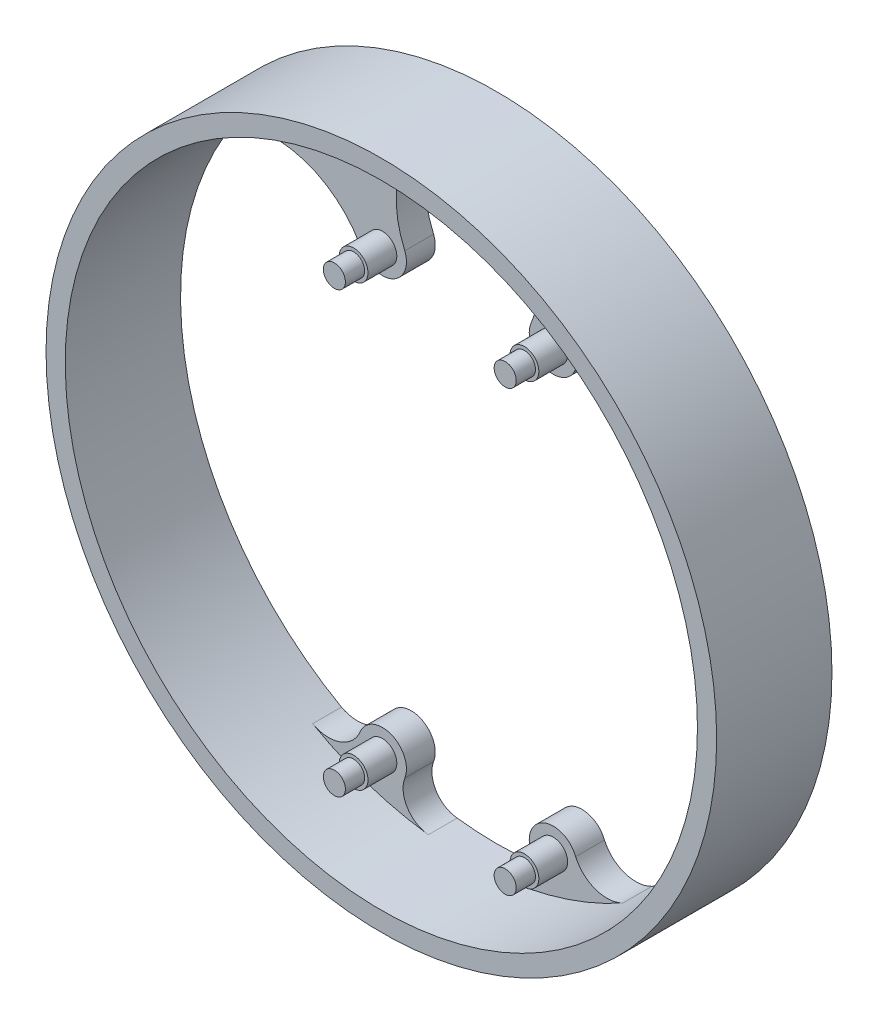
ISO-10303-21;
HEADER;
FILE_DESCRIPTION(('STEP AP214'),'2;1');
FILE_NAME('part.step','',(''),(''),'','','');
FILE_SCHEMA(('AUTOMOTIVE_DESIGN { 1 0 10303 214 1 1 1 1 }'));
ENDSEC;
DATA;
#1=APPLICATION_CONTEXT('core data for automotive mechanical design processes');
#2=APPLICATION_PROTOCOL_DEFINITION('international standard','automotive_design',2000,#1);
#3=PRODUCT_CONTEXT('',#1,'mechanical');
#4=PRODUCT('Part','Part','',(#3));
#5=PRODUCT_RELATED_PRODUCT_CATEGORY('part','',(#4));
#6=PRODUCT_DEFINITION_FORMATION('','',#4);
#7=PRODUCT_DEFINITION_CONTEXT('part definition',#1,'design');
#8=PRODUCT_DEFINITION('design','',#6,#7);
#9=PRODUCT_DEFINITION_SHAPE('','',#8);
#10=(LENGTH_UNIT() NAMED_UNIT(*) SI_UNIT(.MILLI.,.METRE.));
#11=(NAMED_UNIT(*) PLANE_ANGLE_UNIT() SI_UNIT($,.RADIAN.));
#12=(NAMED_UNIT(*) SI_UNIT($,.STERADIAN.) SOLID_ANGLE_UNIT());
#13=UNCERTAINTY_MEASURE_WITH_UNIT(LENGTH_MEASURE(1.E-05),#10,'distance_accuracy_value','');
#14=(GEOMETRIC_REPRESENTATION_CONTEXT(3) GLOBAL_UNCERTAINTY_ASSIGNED_CONTEXT((#13)) GLOBAL_UNIT_ASSIGNED_CONTEXT((#10,
#11,#12)) REPRESENTATION_CONTEXT('',''));
#15=CARTESIAN_POINT('',(0.,0.,0.));
#16=DIRECTION('',(0.,0.,1.));
#17=DIRECTION('',(1.,0.,0.));
#18=AXIS2_PLACEMENT_3D('',#15,#16,#17);
#19=CARTESIAN_POINT('',(0.,0.,3.));
#20=DIRECTION('',(0.,0.,1.));
#21=DIRECTION('',(1.,0.,0.));
#22=AXIS2_PLACEMENT_3D('',#19,#20,#21);
#23=PLANE('',#22);
#24=CARTESIAN_POINT('',(0.,0.,3.));
#25=DIRECTION('',(0.,0.,1.));
#26=DIRECTION('',(1.,0.,0.));
#27=AXIS2_PLACEMENT_3D('',#24,#25,#26);
#28=CIRCLE('',#27,32.9);
#29=CARTESIAN_POINT('',(4.32104825385738,-32.6150048595403,3.));
#30=VERTEX_POINT('',#29);
#31=CARTESIAN_POINT('',(16.1545217327961,-28.6607994931163,3.));
#32=VERTEX_POINT('',#31);
#33=EDGE_CURVE('E356',#30,#32,#28,.T.);
#34=ORIENTED_EDGE('',*,*,#33,.T.);
#35=CARTESIAN_POINT('',(14.4856400572003,-25.4993295163461,3.));
#36=DIRECTION('',(0.,0.,1.));
#37=DIRECTION('',(1.,0.,0.));
#38=AXIS2_PLACEMENT_3D('',#35,#36,#37);
#39=CIRCLE('',#38,3.57492076292037);
#40=CARTESIAN_POINT('',(11.2200116788582,-26.9538843471193,3.));
#41=VERTEX_POINT('',#40);
#42=EDGE_CURVE('E387',#41,#32,#39,.T.);
#43=ORIENTED_EDGE('',*,*,#42,.F.);
#44=CARTESIAN_POINT('',(8.89000000000505,-27.8600000000069,3.));
#45=DIRECTION('',(0.,0.,-1.));
#46=DIRECTION('',(1.,0.,0.));
#47=AXIS2_PLACEMENT_3D('',#44,#45,#46);
#48=CIRCLE('',#47,2.5);
#49=CARTESIAN_POINT('',(6.55998832115192,-28.7661156528945,3.));
#50=VERTEX_POINT('',#49);
#51=EDGE_CURVE('E385',#50,#41,#48,.T.);
#52=ORIENTED_EDGE('',*,*,#51,.F.);
#53=CARTESIAN_POINT('',(3.84469156337696,-29.762250761899,3.));
#54=DIRECTION('',(0.,0.,1.));
#55=DIRECTION('',(-1.,0.,0.));
#56=AXIS2_PLACEMENT_3D('',#53,#54,#55);
#57=CIRCLE('',#56,2.89225200115318);
#58=EDGE_CURVE('E313',#30,#50,#57,.T.);
#59=ORIENTED_EDGE('',*,*,#58,.F.);
#60=EDGE_LOOP('',(#34,#43,#52,#59));
#61=FACE_BOUND('',#60,.T.);
#62=CARTESIAN_POINT('',(8.89000000000505,-27.8600000000069,3.));
#63=DIRECTION('',(0.,0.,1.));
#64=DIRECTION('',(-1.,0.,0.));
#65=AXIS2_PLACEMENT_3D('',#62,#63,#64);
#66=CIRCLE('',#65,1.5);
#67=CARTESIAN_POINT('',(7.39000000000505,-27.8600000000069,3.));
#68=VERTEX_POINT('',#67);
#69=EDGE_CURVE('E360',#68,#68,#66,.T.);
#70=ORIENTED_EDGE('',*,*,#69,.F.);
#71=EDGE_LOOP('',(#70));
#72=FACE_BOUND('',#71,.T.);
#73=ADVANCED_FACE('F33',(#61,#72),#23,.T.);
#74=CARTESIAN_POINT('',(-16.1545217327962,-28.6607994931163,3.));
#75=VERTEX_POINT('',#74);
#76=CARTESIAN_POINT('',(-4.32104825385683,-32.6150048595403,3.));
#77=VERTEX_POINT('',#76);
#78=EDGE_CURVE('E160',#75,#77,#28,.T.);
#79=ORIENTED_EDGE('',*,*,#78,.T.);
#80=CARTESIAN_POINT('',(-3.84469156337696,-29.762250761899,3.));
#81=DIRECTION('',(0.,0.,1.));
#82=DIRECTION('',(1.,0.,0.));
#83=AXIS2_PLACEMENT_3D('',#80,#81,#82);
#84=CIRCLE('',#83,2.89225200115317);
#85=CARTESIAN_POINT('',(-6.5599883211519,-28.7661156528945,3.));
#86=VERTEX_POINT('',#85);
#87=EDGE_CURVE('E305',#86,#77,#84,.T.);
#88=ORIENTED_EDGE('',*,*,#87,.F.);
#89=CARTESIAN_POINT('',(-8.89000000000505,-27.8600000000069,3.));
#90=DIRECTION('',(0.,0.,-1.));
#91=DIRECTION('',(-1.,0.,0.));
#92=AXIS2_PLACEMENT_3D('',#89,#90,#91);
#93=CIRCLE('',#92,2.5);
#94=CARTESIAN_POINT('',(-11.2200116788582,-26.9538843471193,3.));
#95=VERTEX_POINT('',#94);
#96=EDGE_CURVE('E314',#95,#86,#93,.T.);
#97=ORIENTED_EDGE('',*,*,#96,.F.);
#98=CARTESIAN_POINT('',(-14.4856400572003,-25.4993295163461,3.));
#99=DIRECTION('',(0.,0.,1.));
#100=DIRECTION('',(-1.,0.,0.));
#101=AXIS2_PLACEMENT_3D('',#98,#99,#100);
#102=CIRCLE('',#101,3.57492076292037);
#103=EDGE_CURVE('E242',#75,#95,#102,.T.);
#104=ORIENTED_EDGE('',*,*,#103,.F.);
#105=EDGE_LOOP('',(#79,#88,#97,#104));
#106=FACE_BOUND('',#105,.T.);
#107=CARTESIAN_POINT('',(-8.89000000000505,-27.8600000000069,3.));
#108=DIRECTION('',(0.,0.,1.));
#109=DIRECTION('',(1.,0.,0.));
#110=AXIS2_PLACEMENT_3D('',#107,#108,#109);
#111=CIRCLE('',#110,1.5);
#112=CARTESIAN_POINT('',(-7.39000000000505,-27.8600000000069,3.));
#113=VERTEX_POINT('',#112);
#114=EDGE_CURVE('E366',#113,#113,#111,.T.);
#115=ORIENTED_EDGE('',*,*,#114,.F.);
#116=EDGE_LOOP('',(#115));
#117=FACE_BOUND('',#116,.T.);
#118=ADVANCED_FACE('F347',(#106,#117),#23,.T.);
#119=CARTESIAN_POINT('',(0.,32.9,3.));
#120=VERTEX_POINT('',#119);
#121=CARTESIAN_POINT('',(-25.6489339597442,20.6044215334641,3.));
#122=VERTEX_POINT('',#121);
#123=EDGE_CURVE('E150',#120,#122,#28,.T.);
#124=ORIENTED_EDGE('',*,*,#123,.T.);
#125=CARTESIAN_POINT('',(-20.1793391183897,11.8824857007433,3.));
#126=DIRECTION('',(0.,0.,1.));
#127=DIRECTION('',(-1.,0.,0.));
#128=AXIS2_PLACEMENT_3D('',#125,#126,#127);
#129=CIRCLE('',#128,10.2950780666623);
#130=CARTESIAN_POINT('',(-11.2200116788723,16.9538843470915,3.));
#131=VERTEX_POINT('',#130);
#132=EDGE_CURVE('E196',#131,#122,#129,.T.);
#133=ORIENTED_EDGE('',*,*,#132,.F.);
#134=CARTESIAN_POINT('',(-8.8900000000008,17.8599999999914,3.));
#135=DIRECTION('',(0.,0.,-1.));
#136=DIRECTION('',(1.,0.,0.));
#137=AXIS2_PLACEMENT_3D('',#134,#135,#136);
#138=CIRCLE('',#137,2.50000000002189);
#139=CARTESIAN_POINT('',(-6.5599883211273,18.7661156528871,3.));
#140=VERTEX_POINT('',#139);
#141=EDGE_CURVE('E194',#140,#131,#138,.T.);
#142=ORIENTED_EDGE('',*,*,#141,.F.);
#143=CARTESIAN_POINT('',(2.90264107959522,22.9634988309706,3.));
#144=DIRECTION('',(0.,0.,1.));
#145=DIRECTION('',(-1.,0.,0.));
#146=AXIS2_PLACEMENT_3D('',#143,#144,#145);
#147=CIRCLE('',#146,10.3517815239251);
#148=EDGE_CURVE('E180',#120,#140,#147,.T.);
#149=ORIENTED_EDGE('',*,*,#148,.F.);
#150=EDGE_LOOP('',(#124,#133,#142,#149));
#151=FACE_BOUND('',#150,.T.);
#152=CARTESIAN_POINT('',(-8.8900000000008,17.8599999999914,3.));
#153=DIRECTION('',(0.,0.,1.));
#154=DIRECTION('',(1.,0.,0.));
#155=AXIS2_PLACEMENT_3D('',#152,#153,#154);
#156=CIRCLE('',#155,1.5);
#157=CARTESIAN_POINT('',(-7.3900000000008,17.8599999999914,3.));
#158=VERTEX_POINT('',#157);
#159=EDGE_CURVE('E376',#158,#158,#156,.T.);
#160=ORIENTED_EDGE('',*,*,#159,.F.);
#161=EDGE_LOOP('',(#160));
#162=FACE_BOUND('',#161,.T.);
#163=ADVANCED_FACE('F192',(#151,#162),#23,.T.);
#164=CARTESIAN_POINT('',(25.6489339597436,20.6044215334649,3.));
#165=VERTEX_POINT('',#164);
#166=EDGE_CURVE('E154',#165,#120,#28,.T.);
#167=ORIENTED_EDGE('',*,*,#166,.T.);
#168=CARTESIAN_POINT('',(-2.90264107959522,22.9634988309706,3.));
#169=DIRECTION('',(0.,0.,1.));
#170=DIRECTION('',(1.,0.,0.));
#171=AXIS2_PLACEMENT_3D('',#168,#169,#170);
#172=CIRCLE('',#171,10.3517815239251);
#173=CARTESIAN_POINT('',(6.5599883211273,18.7661156528871,3.));
#174=VERTEX_POINT('',#173);
#175=EDGE_CURVE('E169',#174,#120,#172,.T.);
#176=ORIENTED_EDGE('',*,*,#175,.F.);
#177=CARTESIAN_POINT('',(8.8900000000008,17.8599999999914,3.));
#178=DIRECTION('',(0.,0.,-1.));
#179=DIRECTION('',(-1.,0.,0.));
#180=AXIS2_PLACEMENT_3D('',#177,#178,#179);
#181=CIRCLE('',#180,2.50000000002189);
#182=CARTESIAN_POINT('',(11.2200116788723,16.9538843470915,3.));
#183=VERTEX_POINT('',#182);
#184=EDGE_CURVE('E181',#183,#174,#181,.T.);
#185=ORIENTED_EDGE('',*,*,#184,.F.);
#186=CARTESIAN_POINT('',(20.1793391183897,11.8824857007433,3.));
#187=DIRECTION('',(0.,0.,1.));
#188=DIRECTION('',(1.,0.,0.));
#189=AXIS2_PLACEMENT_3D('',#186,#187,#188);
#190=CIRCLE('',#189,10.2950780666623);
#191=EDGE_CURVE('E170',#165,#183,#190,.T.);
#192=ORIENTED_EDGE('',*,*,#191,.F.);
#193=EDGE_LOOP('',(#167,#176,#185,#192));
#194=FACE_BOUND('',#193,.T.);
#195=CARTESIAN_POINT('',(8.8900000000008,17.8599999999914,3.));
#196=DIRECTION('',(0.,0.,1.));
#197=DIRECTION('',(-1.,0.,0.));
#198=AXIS2_PLACEMENT_3D('',#195,#196,#197);
#199=CIRCLE('',#198,1.5);
#200=CARTESIAN_POINT('',(7.3900000000008,17.8599999999914,3.));
#201=VERTEX_POINT('',#200);
#202=EDGE_CURVE('E369',#201,#201,#199,.T.);
#203=ORIENTED_EDGE('',*,*,#202,.F.);
#204=EDGE_LOOP('',(#203));
#205=FACE_BOUND('',#204,.T.);
#206=ADVANCED_FACE('F166',(#194,#205),#23,.T.);
#207=CARTESIAN_POINT('',(0.,0.,0.));
#208=DIRECTION('',(0.,0.,1.));
#209=DIRECTION('',(1.,0.,0.));
#210=AXIS2_PLACEMENT_3D('',#207,#208,#209);
#211=PLANE('',#210);
#212=CARTESIAN_POINT('',(0.,0.,0.));
#213=DIRECTION('',(0.,0.,1.));
#214=DIRECTION('',(1.,0.,0.));
#215=AXIS2_PLACEMENT_3D('',#212,#213,#214);
#216=CIRCLE('',#215,34.9);
#217=CARTESIAN_POINT('',(34.9,0.,0.));
#218=VERTEX_POINT('',#217);
#219=EDGE_CURVE('E265',#218,#218,#216,.T.);
#220=ORIENTED_EDGE('',*,*,#219,.F.);
#221=EDGE_LOOP('',(#220));
#222=FACE_BOUND('',#221,.T.);
#223=CARTESIAN_POINT('',(0.,0.,0.));
#224=DIRECTION('',(0.,0.,1.));
#225=DIRECTION('',(1.,0.,0.));
#226=AXIS2_PLACEMENT_3D('',#223,#224,#225);
#227=CIRCLE('',#226,32.9);
#228=CARTESIAN_POINT('',(-25.6489339597434,20.6044215334646,0.));
#229=VERTEX_POINT('',#228);
#230=CARTESIAN_POINT('',(-16.1545217327961,-28.6607994931164,0.));
#231=VERTEX_POINT('',#230);
#232=EDGE_CURVE('E60',#229,#231,#227,.T.);
#233=ORIENTED_EDGE('',*,*,#232,.T.);
#234=CARTESIAN_POINT('',(-14.4856400572003,-25.4993295163461,0.));
#235=DIRECTION('',(0.,0.,1.));
#236=DIRECTION('',(-1.,0.,0.));
#237=AXIS2_PLACEMENT_3D('',#234,#235,#236);
#238=CIRCLE('',#237,3.57492076292037);
#239=CARTESIAN_POINT('',(-11.2200116788582,-26.9538843471193,0.));
#240=VERTEX_POINT('',#239);
#241=EDGE_CURVE('E202',#231,#240,#238,.T.);
#242=ORIENTED_EDGE('',*,*,#241,.T.);
#243=CARTESIAN_POINT('',(-8.89000000000505,-27.8600000000069,0.));
#244=DIRECTION('',(0.,0.,-1.));
#245=DIRECTION('',(-1.,0.,0.));
#246=AXIS2_PLACEMENT_3D('',#243,#244,#245);
#247=CIRCLE('',#246,2.5);
#248=CARTESIAN_POINT('',(-6.5599883211519,-28.7661156528945,0.));
#249=VERTEX_POINT('',#248);
#250=EDGE_CURVE('E206',#240,#249,#247,.T.);
#251=ORIENTED_EDGE('',*,*,#250,.T.);
#252=CARTESIAN_POINT('',(-3.84469156337696,-29.762250761899,0.));
#253=DIRECTION('',(0.,0.,1.));
#254=DIRECTION('',(1.,0.,0.));
#255=AXIS2_PLACEMENT_3D('',#252,#253,#254);
#256=CIRCLE('',#255,2.89225200115317);
#257=CARTESIAN_POINT('',(-4.10891319559765,-32.6424084949479,0.));
#258=VERTEX_POINT('',#257);
#259=EDGE_CURVE('E209',#249,#258,#256,.T.);
#260=ORIENTED_EDGE('',*,*,#259,.T.);
#261=CARTESIAN_POINT('',(0.,0.,0.));
#262=DIRECTION('',(0.,0.,1.));
#263=DIRECTION('',(1.,0.,0.));
#264=AXIS2_PLACEMENT_3D('',#261,#262,#263);
#265=CIRCLE('',#264,32.9);
#266=CARTESIAN_POINT('',(4.10891319559649,-32.642408494948,0.));
#267=VERTEX_POINT('',#266);
#268=EDGE_CURVE('E212',#258,#267,#265,.T.);
#269=ORIENTED_EDGE('',*,*,#268,.T.);
#270=CARTESIAN_POINT('',(3.84469156337696,-29.762250761899,0.));
#271=DIRECTION('',(0.,0.,1.));
#272=DIRECTION('',(-1.,0.,0.));
#273=AXIS2_PLACEMENT_3D('',#270,#271,#272);
#274=CIRCLE('',#273,2.89225200115318);
#275=CARTESIAN_POINT('',(6.55998832115192,-28.7661156528945,0.));
#276=VERTEX_POINT('',#275);
#277=EDGE_CURVE('E215',#267,#276,#274,.T.);
#278=ORIENTED_EDGE('',*,*,#277,.T.);
#279=CARTESIAN_POINT('',(8.89000000000505,-27.8600000000069,0.));
#280=DIRECTION('',(0.,0.,-1.));
#281=DIRECTION('',(1.,0.,0.));
#282=AXIS2_PLACEMENT_3D('',#279,#280,#281);
#283=CIRCLE('',#282,2.5);
#284=CARTESIAN_POINT('',(11.2200116788582,-26.9538843471193,0.));
#285=VERTEX_POINT('',#284);
#286=EDGE_CURVE('E218',#276,#285,#283,.T.);
#287=ORIENTED_EDGE('',*,*,#286,.T.);
#288=CARTESIAN_POINT('',(14.4856400572003,-25.4993295163461,0.));
#289=DIRECTION('',(0.,0.,1.));
#290=DIRECTION('',(1.,0.,0.));
#291=AXIS2_PLACEMENT_3D('',#288,#289,#290);
#292=CIRCLE('',#291,3.57492076292037);
#293=CARTESIAN_POINT('',(16.1545217327961,-28.6607994931163,0.));
#294=VERTEX_POINT('',#293);
#295=EDGE_CURVE('E221',#285,#294,#292,.T.);
#296=ORIENTED_EDGE('',*,*,#295,.T.);
#297=CARTESIAN_POINT('',(0.,0.,0.));
#298=DIRECTION('',(0.,0.,1.));
#299=DIRECTION('',(1.,0.,0.));
#300=AXIS2_PLACEMENT_3D('',#297,#298,#299);
#301=CIRCLE('',#300,32.9);
#302=CARTESIAN_POINT('',(25.6489339597436,20.6044215334649,0.));
#303=VERTEX_POINT('',#302);
#304=EDGE_CURVE('E224',#294,#303,#301,.T.);
#305=ORIENTED_EDGE('',*,*,#304,.T.);
#306=CARTESIAN_POINT('',(20.1793391183897,11.8824857007433,0.));
#307=DIRECTION('',(0.,0.,1.));
#308=DIRECTION('',(1.,0.,0.));
#309=AXIS2_PLACEMENT_3D('',#306,#307,#308);
#310=CIRCLE('',#309,10.2950780666623);
#311=CARTESIAN_POINT('',(11.2200116788723,16.9538843470915,0.));
#312=VERTEX_POINT('',#311);
#313=EDGE_CURVE('E227',#303,#312,#310,.T.);
#314=ORIENTED_EDGE('',*,*,#313,.T.);
#315=CARTESIAN_POINT('',(8.8900000000008,17.8599999999914,0.));
#316=DIRECTION('',(0.,0.,-1.));
#317=DIRECTION('',(-1.,0.,0.));
#318=AXIS2_PLACEMENT_3D('',#315,#316,#317);
#319=CIRCLE('',#318,2.50000000002189);
#320=CARTESIAN_POINT('',(6.5599883211273,18.7661156528871,0.));
#321=VERTEX_POINT('',#320);
#322=EDGE_CURVE('E230',#312,#321,#319,.T.);
#323=ORIENTED_EDGE('',*,*,#322,.T.);
#324=CARTESIAN_POINT('',(-2.90264107959522,22.9634988309706,0.));
#325=DIRECTION('',(0.,0.,1.));
#326=DIRECTION('',(1.,0.,0.));
#327=AXIS2_PLACEMENT_3D('',#324,#325,#326);
#328=CIRCLE('',#327,10.3517815239251);
#329=CARTESIAN_POINT('',(0.,32.9,0.));
#330=VERTEX_POINT('',#329);
#331=EDGE_CURVE('E233',#321,#330,#328,.T.);
#332=ORIENTED_EDGE('',*,*,#331,.T.);
#333=CARTESIAN_POINT('',(2.90264107959522,22.9634988309706,0.));
#334=DIRECTION('',(0.,0.,1.));
#335=DIRECTION('',(-1.,0.,0.));
#336=AXIS2_PLACEMENT_3D('',#333,#334,#335);
#337=CIRCLE('',#336,10.3517815239251);
#338=CARTESIAN_POINT('',(-6.5599883211273,18.7661156528871,0.));
#339=VERTEX_POINT('',#338);
#340=EDGE_CURVE('E187',#330,#339,#337,.T.);
#341=ORIENTED_EDGE('',*,*,#340,.T.);
#342=CARTESIAN_POINT('',(-8.8900000000008,17.8599999999914,0.));
#343=DIRECTION('',(0.,0.,-1.));
#344=DIRECTION('',(1.,0.,0.));
#345=AXIS2_PLACEMENT_3D('',#342,#343,#344);
#346=CIRCLE('',#345,2.50000000002189);
#347=CARTESIAN_POINT('',(-11.2200116788726,16.9538843470914,0.));
#348=VERTEX_POINT('',#347);
#349=EDGE_CURVE('E236',#339,#348,#346,.T.);
#350=ORIENTED_EDGE('',*,*,#349,.T.);
#351=CARTESIAN_POINT('',(-20.1793391183897,11.8824857007433,0.));
#352=DIRECTION('',(0.,0.,1.));
#353=DIRECTION('',(-1.,0.,0.));
#354=AXIS2_PLACEMENT_3D('',#351,#352,#353);
#355=CIRCLE('',#354,10.2950780666623);
#356=EDGE_CURVE('E239',#348,#229,#355,.T.);
#357=ORIENTED_EDGE('',*,*,#356,.T.);
#358=EDGE_LOOP('',(#233,#242,#251,#260,#269,#278,#287,#296,#305,#314,#323,#332,#341,#350,#357));
#359=FACE_BOUND('',#358,.T.);
#360=ADVANCED_FACE('F337',(#222,#359),#211,.F.);
#361=CARTESIAN_POINT('',(0.,0.,3.));
#362=DIRECTION('',(0.,0.,-1.));
#363=DIRECTION('',(-1.,0.,0.));
#364=AXIS2_PLACEMENT_3D('',#361,#362,#363);
#365=CYLINDRICAL_SURFACE('',#364,34.9);
#366=ORIENTED_EDGE('',*,*,#219,.T.);
#367=EDGE_LOOP('',(#366));
#368=FACE_BOUND('',#367,.T.);
#369=CARTESIAN_POINT('',(0.,0.,12.));
#370=DIRECTION('',(0.,0.,1.));
#371=DIRECTION('',(1.,0.,0.));
#372=AXIS2_PLACEMENT_3D('',#369,#370,#371);
#373=CIRCLE('',#372,34.9);
#374=CARTESIAN_POINT('',(34.9,0.,12.));
#375=VERTEX_POINT('',#374);
#376=EDGE_CURVE('E415',#375,#375,#373,.T.);
#377=ORIENTED_EDGE('',*,*,#376,.F.);
#378=EDGE_LOOP('',(#377));
#379=FACE_BOUND('',#378,.T.);
#380=ADVANCED_FACE('F35',(#368,#379),#365,.T.);
#381=CARTESIAN_POINT('',(0.,0.,3.));
#382=DIRECTION('',(0.,0.,-1.));
#383=DIRECTION('',(-1.,0.,0.));
#384=AXIS2_PLACEMENT_3D('',#381,#382,#383);
#385=CYLINDRICAL_SURFACE('',#384,32.9);
#386=ORIENTED_EDGE('',*,*,#232,.F.);
#387=DIRECTION('',(0.,0.,-1.));
#388=VECTOR('',#387,1.);
#389=CARTESIAN_POINT('',(-25.6489339597434,20.6044215334646,3.));
#390=LINE('',#389,#388);
#391=EDGE_CURVE('E156',#122,#229,#390,.T.);
#392=ORIENTED_EDGE('',*,*,#391,.F.);
#393=ORIENTED_EDGE('',*,*,#123,.F.);
#394=ORIENTED_EDGE('',*,*,#166,.F.);
#395=DIRECTION('',(0.,0.,-1.));
#396=VECTOR('',#395,1.);
#397=CARTESIAN_POINT('',(25.6489339597436,20.6044215334649,3.));
#398=LINE('',#397,#396);
#399=EDGE_CURVE('E249',#165,#303,#398,.T.);
#400=ORIENTED_EDGE('',*,*,#399,.T.);
#401=ORIENTED_EDGE('',*,*,#304,.F.);
#402=DIRECTION('',(0.,0.,-1.));
#403=VECTOR('',#402,1.);
#404=CARTESIAN_POINT('',(16.1545217327961,-28.6607994931163,3.));
#405=LINE('',#404,#403);
#406=EDGE_CURVE('E251',#32,#294,#405,.T.);
#407=ORIENTED_EDGE('',*,*,#406,.F.);
#408=ORIENTED_EDGE('',*,*,#33,.F.);
#409=CARTESIAN_POINT('',(3.84469156337696,-29.762250761899,3.));
#410=DIRECTION('',(0.,0.,1.));
#411=DIRECTION('',(0.091354982938617,-0.995818390617629,0.));
#412=AXIS2_PLACEMENT_3D('',#409,#410,#411);
#413=CIRCLE('',#412,2.89225200115318);
#414=CARTESIAN_POINT('',(4.10891319559706,-32.6424084949479,3.));
#415=VERTEX_POINT('',#414);
#416=EDGE_CURVE('E274',#415,#30,#413,.T.);
#417=ORIENTED_EDGE('',*,*,#416,.F.);
#418=DIRECTION('',(0.,0.,-1.));
#419=VECTOR('',#418,1.);
#420=CARTESIAN_POINT('',(4.10891319559649,-32.642408494948,3.));
#421=LINE('',#420,#419);
#422=EDGE_CURVE('E257',#415,#267,#421,.T.);
#423=ORIENTED_EDGE('',*,*,#422,.T.);
#424=ORIENTED_EDGE('',*,*,#268,.F.);
#425=DIRECTION('',(0.,0.,-1.));
#426=VECTOR('',#425,1.);
#427=CARTESIAN_POINT('',(-4.10891319559765,-32.6424084949479,3.));
#428=LINE('',#427,#426);
#429=CARTESIAN_POINT('',(-4.10891319559765,-32.6424084949479,3.));
#430=VERTEX_POINT('',#429);
#431=EDGE_CURVE('E261',#430,#258,#428,.T.);
#432=ORIENTED_EDGE('',*,*,#431,.F.);
#433=CARTESIAN_POINT('',(-3.84469156337696,-29.762250761899,3.));
#434=DIRECTION('',(0.,0.,1.));
#435=DIRECTION('',(-0.164700963225174,-0.986343547002108,0.));
#436=AXIS2_PLACEMENT_3D('',#433,#434,#435);
#437=CIRCLE('',#436,2.89225200115317);
#438=EDGE_CURVE('E322',#77,#430,#437,.T.);
#439=ORIENTED_EDGE('',*,*,#438,.F.);
#440=ORIENTED_EDGE('',*,*,#78,.F.);
#441=DIRECTION('',(0.,0.,-1.));
#442=VECTOR('',#441,1.);
#443=CARTESIAN_POINT('',(-16.1545217327961,-28.6607994931164,3.));
#444=LINE('',#443,#442);
#445=EDGE_CURVE('E263',#75,#231,#444,.T.);
#446=ORIENTED_EDGE('',*,*,#445,.T.);
#447=EDGE_LOOP('',(#386,#392,#393,#394,#400,#401,#407,#408,#417,#423,#424,#432,#439,#440,#446));
#448=FACE_BOUND('',#447,.T.);
#449=CARTESIAN_POINT('',(0.,0.,12.));
#450=DIRECTION('',(0.,0.,1.));
#451=DIRECTION('',(1.,0.,0.));
#452=AXIS2_PLACEMENT_3D('',#449,#450,#451);
#453=CIRCLE('',#452,32.9);
#454=CARTESIAN_POINT('',(32.9,0.,12.));
#455=VERTEX_POINT('',#454);
#456=EDGE_CURVE('E171',#455,#455,#453,.T.);
#457=ORIENTED_EDGE('',*,*,#456,.T.);
#458=EDGE_LOOP('',(#457));
#459=FACE_BOUND('',#458,.T.);
#460=ADVANCED_FACE('F152',(#448,#459),#385,.F.);
#461=CARTESIAN_POINT('',(-14.4856400572003,-25.4993295163461,3.));
#462=DIRECTION('',(0.,0.,-1.));
#463=DIRECTION('',(-1.,0.,0.));
#464=AXIS2_PLACEMENT_3D('',#461,#462,#463);
#465=CYLINDRICAL_SURFACE('',#464,3.57492076292037);
#466=ORIENTED_EDGE('',*,*,#241,.F.);
#467=ORIENTED_EDGE('',*,*,#445,.F.);
#468=ORIENTED_EDGE('',*,*,#103,.T.);
#469=DIRECTION('',(0.,0.,-1.));
#470=VECTOR('',#469,1.);
#471=CARTESIAN_POINT('',(-11.2200116788582,-26.9538843471193,3.));
#472=LINE('',#471,#470);
#473=EDGE_CURVE('E260',#95,#240,#472,.T.);
#474=ORIENTED_EDGE('',*,*,#473,.T.);
#475=EDGE_LOOP('',(#466,#467,#468,#474));
#476=FACE_BOUND('',#475,.T.);
#477=ADVANCED_FACE('F334',(#476),#465,.F.);
#478=CARTESIAN_POINT('',(-8.89000000000505,-27.8600000000069,3.));
#479=DIRECTION('',(0.,0.,-1.));
#480=DIRECTION('',(-1.,0.,0.));
#481=AXIS2_PLACEMENT_3D('',#478,#479,#480);
#482=CYLINDRICAL_SURFACE('',#481,2.5);
#483=ORIENTED_EDGE('',*,*,#250,.F.);
#484=ORIENTED_EDGE('',*,*,#473,.F.);
#485=ORIENTED_EDGE('',*,*,#96,.T.);
#486=DIRECTION('',(0.,0.,-1.));
#487=VECTOR('',#486,1.);
#488=CARTESIAN_POINT('',(-6.5599883211519,-28.7661156528945,3.));
#489=LINE('',#488,#487);
#490=EDGE_CURVE('E258',#86,#249,#489,.T.);
#491=ORIENTED_EDGE('',*,*,#490,.T.);
#492=EDGE_LOOP('',(#483,#484,#485,#491));
#493=FACE_BOUND('',#492,.T.);
#494=ADVANCED_FACE('F296',(#493),#482,.T.);
#495=CARTESIAN_POINT('',(-3.84469156337696,-29.762250761899,3.));
#496=DIRECTION('',(0.,0.,-1.));
#497=DIRECTION('',(-1.,0.,0.));
#498=AXIS2_PLACEMENT_3D('',#495,#496,#497);
#499=CYLINDRICAL_SURFACE('',#498,2.89225200115317);
#500=ORIENTED_EDGE('',*,*,#259,.F.);
#501=ORIENTED_EDGE('',*,*,#490,.F.);
#502=ORIENTED_EDGE('',*,*,#87,.T.);
#503=ORIENTED_EDGE('',*,*,#438,.T.);
#504=ORIENTED_EDGE('',*,*,#431,.T.);
#505=EDGE_LOOP('',(#500,#501,#502,#503,#504));
#506=FACE_BOUND('',#505,.T.);
#507=ADVANCED_FACE('F291',(#506),#499,.F.);
#508=CARTESIAN_POINT('',(3.84469156337696,-29.762250761899,3.));
#509=DIRECTION('',(0.,0.,-1.));
#510=DIRECTION('',(-1.,0.,0.));
#511=AXIS2_PLACEMENT_3D('',#508,#509,#510);
#512=CYLINDRICAL_SURFACE('',#511,2.89225200115318);
#513=ORIENTED_EDGE('',*,*,#277,.F.);
#514=ORIENTED_EDGE('',*,*,#422,.F.);
#515=ORIENTED_EDGE('',*,*,#416,.T.);
#516=ORIENTED_EDGE('',*,*,#58,.T.);
#517=DIRECTION('',(0.,0.,-1.));
#518=VECTOR('',#517,1.);
#519=CARTESIAN_POINT('',(6.55998832115192,-28.7661156528945,3.));
#520=LINE('',#519,#518);
#521=EDGE_CURVE('E255',#50,#276,#520,.T.);
#522=ORIENTED_EDGE('',*,*,#521,.T.);
#523=EDGE_LOOP('',(#513,#514,#515,#516,#522));
#524=FACE_BOUND('',#523,.T.);
#525=ADVANCED_FACE('F280',(#524),#512,.F.);
#526=CARTESIAN_POINT('',(8.89000000000505,-27.8600000000069,3.));
#527=DIRECTION('',(0.,0.,-1.));
#528=DIRECTION('',(-1.,0.,0.));
#529=AXIS2_PLACEMENT_3D('',#526,#527,#528);
#530=CYLINDRICAL_SURFACE('',#529,2.5);
#531=ORIENTED_EDGE('',*,*,#286,.F.);
#532=ORIENTED_EDGE('',*,*,#521,.F.);
#533=ORIENTED_EDGE('',*,*,#51,.T.);
#534=DIRECTION('',(0.,0.,-1.));
#535=VECTOR('',#534,1.);
#536=CARTESIAN_POINT('',(11.2200116788582,-26.9538843471193,3.));
#537=LINE('',#536,#535);
#538=EDGE_CURVE('E253',#41,#285,#537,.T.);
#539=ORIENTED_EDGE('',*,*,#538,.T.);
#540=EDGE_LOOP('',(#531,#532,#533,#539));
#541=FACE_BOUND('',#540,.T.);
#542=ADVANCED_FACE('F290',(#541),#530,.T.);
#543=CARTESIAN_POINT('',(14.4856400572003,-25.4993295163461,3.));
#544=DIRECTION('',(0.,0.,-1.));
#545=DIRECTION('',(-1.,0.,0.));
#546=AXIS2_PLACEMENT_3D('',#543,#544,#545);
#547=CYLINDRICAL_SURFACE('',#546,3.57492076292037);
#548=ORIENTED_EDGE('',*,*,#295,.F.);
#549=ORIENTED_EDGE('',*,*,#538,.F.);
#550=ORIENTED_EDGE('',*,*,#42,.T.);
#551=ORIENTED_EDGE('',*,*,#406,.T.);
#552=EDGE_LOOP('',(#548,#549,#550,#551));
#553=FACE_BOUND('',#552,.T.);
#554=ADVANCED_FACE('F402',(#553),#547,.F.);
#555=CARTESIAN_POINT('',(20.1793391183897,11.8824857007433,3.));
#556=DIRECTION('',(0.,0.,-1.));
#557=DIRECTION('',(-1.,0.,0.));
#558=AXIS2_PLACEMENT_3D('',#555,#556,#557);
#559=CYLINDRICAL_SURFACE('',#558,10.2950780666623);
#560=ORIENTED_EDGE('',*,*,#313,.F.);
#561=ORIENTED_EDGE('',*,*,#399,.F.);
#562=ORIENTED_EDGE('',*,*,#191,.T.);
#563=DIRECTION('',(0.,0.,-1.));
#564=VECTOR('',#563,1.);
#565=CARTESIAN_POINT('',(11.2200116788723,16.9538843470915,3.));
#566=LINE('',#565,#564);
#567=EDGE_CURVE('E247',#183,#312,#566,.T.);
#568=ORIENTED_EDGE('',*,*,#567,.T.);
#569=EDGE_LOOP('',(#560,#561,#562,#568));
#570=FACE_BOUND('',#569,.T.);
#571=ADVANCED_FACE('F395',(#570),#559,.F.);
#572=CARTESIAN_POINT('',(8.8900000000008,17.8599999999914,3.));
#573=DIRECTION('',(0.,0.,-1.));
#574=DIRECTION('',(-1.,0.,0.));
#575=AXIS2_PLACEMENT_3D('',#572,#573,#574);
#576=CYLINDRICAL_SURFACE('',#575,2.50000000002189);
#577=ORIENTED_EDGE('',*,*,#322,.F.);
#578=ORIENTED_EDGE('',*,*,#567,.F.);
#579=ORIENTED_EDGE('',*,*,#184,.T.);
#580=DIRECTION('',(0.,0.,-1.));
#581=VECTOR('',#580,1.);
#582=CARTESIAN_POINT('',(6.5599883211273,18.7661156528871,3.));
#583=LINE('',#582,#581);
#584=EDGE_CURVE('E179',#174,#321,#583,.T.);
#585=ORIENTED_EDGE('',*,*,#584,.T.);
#586=EDGE_LOOP('',(#577,#578,#579,#585));
#587=FACE_BOUND('',#586,.T.);
#588=ADVANCED_FACE('F392',(#587),#576,.T.);
#589=CARTESIAN_POINT('',(-2.90264107959522,22.9634988309706,3.));
#590=DIRECTION('',(0.,0.,-1.));
#591=DIRECTION('',(-1.,0.,0.));
#592=AXIS2_PLACEMENT_3D('',#589,#590,#591);
#593=CYLINDRICAL_SURFACE('',#592,10.3517815239251);
#594=ORIENTED_EDGE('',*,*,#331,.F.);
#595=ORIENTED_EDGE('',*,*,#584,.F.);
#596=ORIENTED_EDGE('',*,*,#175,.T.);
#597=DIRECTION('',(0.,0.,-1.));
#598=VECTOR('',#597,1.);
#599=CARTESIAN_POINT('',(0.,32.9,3.));
#600=LINE('',#599,#598);
#601=EDGE_CURVE('E177',#120,#330,#600,.T.);
#602=ORIENTED_EDGE('',*,*,#601,.T.);
#603=EDGE_LOOP('',(#594,#595,#596,#602));
#604=FACE_BOUND('',#603,.T.);
#605=ADVANCED_FACE('F176',(#604),#593,.F.);
#606=CARTESIAN_POINT('',(2.90264107959522,22.9634988309706,3.));
#607=DIRECTION('',(0.,0.,-1.));
#608=DIRECTION('',(-1.,0.,0.));
#609=AXIS2_PLACEMENT_3D('',#606,#607,#608);
#610=CYLINDRICAL_SURFACE('',#609,10.3517815239251);
#611=ORIENTED_EDGE('',*,*,#340,.F.);
#612=ORIENTED_EDGE('',*,*,#601,.F.);
#613=ORIENTED_EDGE('',*,*,#148,.T.);
#614=DIRECTION('',(0.,0.,-1.));
#615=VECTOR('',#614,1.);
#616=CARTESIAN_POINT('',(-6.5599883211273,18.7661156528871,3.));
#617=LINE('',#616,#615);
#618=EDGE_CURVE('E189',#140,#339,#617,.T.);
#619=ORIENTED_EDGE('',*,*,#618,.T.);
#620=EDGE_LOOP('',(#611,#612,#613,#619));
#621=FACE_BOUND('',#620,.T.);
#622=ADVANCED_FACE('F184',(#621),#610,.F.);
#623=CARTESIAN_POINT('',(-8.8900000000008,17.8599999999914,3.));
#624=DIRECTION('',(0.,0.,-1.));
#625=DIRECTION('',(-1.,0.,0.));
#626=AXIS2_PLACEMENT_3D('',#623,#624,#625);
#627=CYLINDRICAL_SURFACE('',#626,2.50000000002189);
#628=ORIENTED_EDGE('',*,*,#349,.F.);
#629=ORIENTED_EDGE('',*,*,#618,.F.);
#630=ORIENTED_EDGE('',*,*,#141,.T.);
#631=DIRECTION('',(0.,0.,-1.));
#632=VECTOR('',#631,1.);
#633=CARTESIAN_POINT('',(-11.2200116788726,16.9538843470914,3.));
#634=LINE('',#633,#632);
#635=EDGE_CURVE('E52',#131,#348,#634,.T.);
#636=ORIENTED_EDGE('',*,*,#635,.T.);
#637=EDGE_LOOP('',(#628,#629,#630,#636));
#638=FACE_BOUND('',#637,.T.);
#639=ADVANCED_FACE('F488',(#638),#627,.T.);
#640=CARTESIAN_POINT('',(-20.1793391183897,11.8824857007433,3.));
#641=DIRECTION('',(0.,0.,-1.));
#642=DIRECTION('',(-1.,0.,0.));
#643=AXIS2_PLACEMENT_3D('',#640,#641,#642);
#644=CYLINDRICAL_SURFACE('',#643,10.2950780666623);
#645=ORIENTED_EDGE('',*,*,#356,.F.);
#646=ORIENTED_EDGE('',*,*,#635,.F.);
#647=ORIENTED_EDGE('',*,*,#132,.T.);
#648=ORIENTED_EDGE('',*,*,#391,.T.);
#649=EDGE_LOOP('',(#645,#646,#647,#648));
#650=FACE_BOUND('',#649,.T.);
#651=ADVANCED_FACE('F484',(#650),#644,.F.);
#652=CARTESIAN_POINT('',(-8.8900000000008,17.8599999999914,6.));
#653=DIRECTION('',(0.,0.,-1.));
#654=DIRECTION('',(-1.,0.,0.));
#655=AXIS2_PLACEMENT_3D('',#652,#653,#654);
#656=CYLINDRICAL_SURFACE('',#655,1.5);
#657=CARTESIAN_POINT('',(-8.8900000000008,17.8599999999914,6.));
#658=DIRECTION('',(0.,0.,1.));
#659=DIRECTION('',(1.,0.,0.));
#660=AXIS2_PLACEMENT_3D('',#657,#658,#659);
#661=CIRCLE('',#660,1.5);
#662=CARTESIAN_POINT('',(-7.3900000000008,17.8599999999914,6.));
#663=VERTEX_POINT('',#662);
#664=EDGE_CURVE('E203',#663,#663,#661,.T.);
#665=ORIENTED_EDGE('',*,*,#664,.F.);
#666=EDGE_LOOP('',(#665));
#667=FACE_BOUND('',#666,.T.);
#668=ORIENTED_EDGE('',*,*,#159,.T.);
#669=EDGE_LOOP('',(#668));
#670=FACE_BOUND('',#669,.T.);
#671=ADVANCED_FACE('F480',(#667,#670),#656,.T.);
#672=CARTESIAN_POINT('',(-8.8900000000008,17.8599999999914,6.));
#673=DIRECTION('',(0.,0.,1.));
#674=DIRECTION('',(1.,0.,0.));
#675=AXIS2_PLACEMENT_3D('',#672,#673,#674);
#676=PLANE('',#675);
#677=CARTESIAN_POINT('',(-8.8900000000008,17.8599999999914,6.));
#678=DIRECTION('',(0.,0.,1.));
#679=DIRECTION('',(1.,0.,0.));
#680=AXIS2_PLACEMENT_3D('',#677,#678,#679);
#681=CIRCLE('',#680,1.15);
#682=CARTESIAN_POINT('',(-7.7400000000008,17.8599999999914,6.));
#683=VERTEX_POINT('',#682);
#684=EDGE_CURVE('E437',#683,#683,#681,.T.);
#685=ORIENTED_EDGE('',*,*,#684,.F.);
#686=EDGE_LOOP('',(#685));
#687=FACE_BOUND('',#686,.T.);
#688=ORIENTED_EDGE('',*,*,#664,.T.);
#689=EDGE_LOOP('',(#688));
#690=FACE_BOUND('',#689,.T.);
#691=ADVANCED_FACE('F476',(#687,#690),#676,.T.);
#692=CARTESIAN_POINT('',(-8.89000000000505,-27.8600000000069,6.));
#693=DIRECTION('',(0.,0.,-1.));
#694=DIRECTION('',(-1.,0.,0.));
#695=AXIS2_PLACEMENT_3D('',#692,#693,#694);
#696=CYLINDRICAL_SURFACE('',#695,1.5);
#697=CARTESIAN_POINT('',(-8.89000000000505,-27.8600000000069,6.));
#698=DIRECTION('',(0.,0.,1.));
#699=DIRECTION('',(1.,0.,0.));
#700=AXIS2_PLACEMENT_3D('',#697,#698,#699);
#701=CIRCLE('',#700,1.5);
#702=CARTESIAN_POINT('',(-7.39000000000505,-27.8600000000069,6.));
#703=VERTEX_POINT('',#702);
#704=EDGE_CURVE('E373',#703,#703,#701,.T.);
#705=ORIENTED_EDGE('',*,*,#704,.F.);
#706=EDGE_LOOP('',(#705));
#707=FACE_BOUND('',#706,.T.);
#708=ORIENTED_EDGE('',*,*,#114,.T.);
#709=EDGE_LOOP('',(#708));
#710=FACE_BOUND('',#709,.T.);
#711=ADVANCED_FACE('F472',(#707,#710),#696,.T.);
#712=CARTESIAN_POINT('',(-8.89000000000505,-27.8600000000069,6.));
#713=DIRECTION('',(0.,0.,1.));
#714=DIRECTION('',(1.,0.,0.));
#715=AXIS2_PLACEMENT_3D('',#712,#713,#714);
#716=PLANE('',#715);
#717=CARTESIAN_POINT('',(-8.89000000000505,-27.8600000000069,6.));
#718=DIRECTION('',(0.,0.,1.));
#719=DIRECTION('',(1.,0.,0.));
#720=AXIS2_PLACEMENT_3D('',#717,#718,#719);
#721=CIRCLE('',#720,1.15);
#722=CARTESIAN_POINT('',(-7.74000000000505,-27.8600000000069,6.));
#723=VERTEX_POINT('',#722);
#724=EDGE_CURVE('E431',#723,#723,#721,.T.);
#725=ORIENTED_EDGE('',*,*,#724,.F.);
#726=EDGE_LOOP('',(#725));
#727=FACE_BOUND('',#726,.T.);
#728=ORIENTED_EDGE('',*,*,#704,.T.);
#729=EDGE_LOOP('',(#728));
#730=FACE_BOUND('',#729,.T.);
#731=ADVANCED_FACE('F468',(#727,#730),#716,.T.);
#732=CARTESIAN_POINT('',(8.89000000000505,-27.8600000000069,6.));
#733=DIRECTION('',(0.,0.,-1.));
#734=DIRECTION('',(-1.,0.,0.));
#735=AXIS2_PLACEMENT_3D('',#732,#733,#734);
#736=CYLINDRICAL_SURFACE('',#735,1.5);
#737=CARTESIAN_POINT('',(8.89000000000505,-27.8600000000069,6.));
#738=DIRECTION('',(0.,0.,1.));
#739=DIRECTION('',(-1.,0.,0.));
#740=AXIS2_PLACEMENT_3D('',#737,#738,#739);
#741=CIRCLE('',#740,1.5);
#742=CARTESIAN_POINT('',(7.39000000000505,-27.8600000000069,6.));
#743=VERTEX_POINT('',#742);
#744=EDGE_CURVE('E362',#743,#743,#741,.T.);
#745=ORIENTED_EDGE('',*,*,#744,.F.);
#746=EDGE_LOOP('',(#745));
#747=FACE_BOUND('',#746,.T.);
#748=ORIENTED_EDGE('',*,*,#69,.T.);
#749=EDGE_LOOP('',(#748));
#750=FACE_BOUND('',#749,.T.);
#751=ADVANCED_FACE('F460',(#747,#750),#736,.T.);
#752=CARTESIAN_POINT('',(8.89000000000505,-27.8600000000069,6.));
#753=DIRECTION('',(0.,0.,-1.));
#754=DIRECTION('',(-1.,0.,0.));
#755=AXIS2_PLACEMENT_3D('',#752,#753,#754);
#756=PLANE('',#755);
#757=CARTESIAN_POINT('',(8.89000000000505,-27.8600000000069,6.));
#758=DIRECTION('',(0.,0.,-1.));
#759=DIRECTION('',(-1.,0.,0.));
#760=AXIS2_PLACEMENT_3D('',#757,#758,#759);
#761=CIRCLE('',#760,1.15);
#762=CARTESIAN_POINT('',(7.74000000000505,-27.8600000000069,6.));
#763=VERTEX_POINT('',#762);
#764=EDGE_CURVE('E44',#763,#763,#761,.F.);
#765=ORIENTED_EDGE('',*,*,#764,.F.);
#766=EDGE_LOOP('',(#765));
#767=FACE_BOUND('',#766,.T.);
#768=ORIENTED_EDGE('',*,*,#744,.T.);
#769=EDGE_LOOP('',(#768));
#770=FACE_BOUND('',#769,.T.);
#771=ADVANCED_FACE('F450',(#767,#770),#756,.F.);
#772=CARTESIAN_POINT('',(8.8900000000008,17.8599999999914,6.));
#773=DIRECTION('',(0.,0.,-1.));
#774=DIRECTION('',(-1.,0.,0.));
#775=AXIS2_PLACEMENT_3D('',#772,#773,#774);
#776=CYLINDRICAL_SURFACE('',#775,1.5);
#777=CARTESIAN_POINT('',(8.8900000000008,17.8599999999914,6.));
#778=DIRECTION('',(0.,0.,1.));
#779=DIRECTION('',(-1.,0.,0.));
#780=AXIS2_PLACEMENT_3D('',#777,#778,#779);
#781=CIRCLE('',#780,1.5);
#782=CARTESIAN_POINT('',(7.3900000000008,17.8599999999914,6.));
#783=VERTEX_POINT('',#782);
#784=EDGE_CURVE('E363',#783,#783,#781,.T.);
#785=ORIENTED_EDGE('',*,*,#784,.F.);
#786=EDGE_LOOP('',(#785));
#787=FACE_BOUND('',#786,.T.);
#788=ORIENTED_EDGE('',*,*,#202,.T.);
#789=EDGE_LOOP('',(#788));
#790=FACE_BOUND('',#789,.T.);
#791=ADVANCED_FACE('F447',(#787,#790),#776,.T.);
#792=CARTESIAN_POINT('',(8.8900000000008,17.8599999999914,6.));
#793=DIRECTION('',(0.,0.,-1.));
#794=DIRECTION('',(-1.,0.,0.));
#795=AXIS2_PLACEMENT_3D('',#792,#793,#794);
#796=PLANE('',#795);
#797=CARTESIAN_POINT('',(8.8900000000008,17.8599999999914,6.));
#798=DIRECTION('',(0.,0.,-1.));
#799=DIRECTION('',(-1.,0.,0.));
#800=AXIS2_PLACEMENT_3D('',#797,#798,#799);
#801=CIRCLE('',#800,1.15);
#802=CARTESIAN_POINT('',(7.7400000000008,17.8599999999914,6.));
#803=VERTEX_POINT('',#802);
#804=EDGE_CURVE('E11',#803,#803,#801,.F.);
#805=ORIENTED_EDGE('',*,*,#804,.F.);
#806=EDGE_LOOP('',(#805));
#807=FACE_BOUND('',#806,.T.);
#808=ORIENTED_EDGE('',*,*,#784,.T.);
#809=EDGE_LOOP('',(#808));
#810=FACE_BOUND('',#809,.T.);
#811=ADVANCED_FACE('F449',(#807,#810),#796,.F.);
#812=CARTESIAN_POINT('',(-8.8900000000008,17.8599999999914,8.));
#813=DIRECTION('',(0.,0.,-1.));
#814=DIRECTION('',(-1.,0.,0.));
#815=AXIS2_PLACEMENT_3D('',#812,#813,#814);
#816=CYLINDRICAL_SURFACE('',#815,1.15);
#817=CARTESIAN_POINT('',(-8.8900000000008,17.8599999999914,8.));
#818=DIRECTION('',(0.,0.,1.));
#819=DIRECTION('',(1.,0.,0.));
#820=AXIS2_PLACEMENT_3D('',#817,#818,#819);
#821=CIRCLE('',#820,1.15);
#822=CARTESIAN_POINT('',(-7.7400000000008,17.8599999999914,8.));
#823=VERTEX_POINT('',#822);
#824=EDGE_CURVE('E440',#823,#823,#821,.T.);
#825=ORIENTED_EDGE('',*,*,#824,.F.);
#826=EDGE_LOOP('',(#825));
#827=FACE_BOUND('',#826,.T.);
#828=ORIENTED_EDGE('',*,*,#684,.T.);
#829=EDGE_LOOP('',(#828));
#830=FACE_BOUND('',#829,.T.);
#831=ADVANCED_FACE('F457',(#827,#830),#816,.T.);
#832=CARTESIAN_POINT('',(-8.8900000000008,17.8599999999914,8.));
#833=DIRECTION('',(0.,0.,1.));
#834=DIRECTION('',(1.,0.,0.));
#835=AXIS2_PLACEMENT_3D('',#832,#833,#834);
#836=PLANE('',#835);
#837=ORIENTED_EDGE('',*,*,#824,.T.);
#838=EDGE_LOOP('',(#837));
#839=FACE_BOUND('',#838,.T.);
#840=ADVANCED_FACE('F622',(#839),#836,.T.);
#841=CARTESIAN_POINT('',(-8.89000000000505,-27.8600000000069,8.));
#842=DIRECTION('',(0.,0.,-1.));
#843=DIRECTION('',(-1.,0.,0.));
#844=AXIS2_PLACEMENT_3D('',#841,#842,#843);
#845=CYLINDRICAL_SURFACE('',#844,1.15);
#846=CARTESIAN_POINT('',(-8.89000000000505,-27.8600000000069,8.));
#847=DIRECTION('',(0.,0.,1.));
#848=DIRECTION('',(1.,0.,0.));
#849=AXIS2_PLACEMENT_3D('',#846,#847,#848);
#850=CIRCLE('',#849,1.15);
#851=CARTESIAN_POINT('',(-7.74000000000505,-27.8600000000069,8.));
#852=VERTEX_POINT('',#851);
#853=EDGE_CURVE('E434',#852,#852,#850,.T.);
#854=ORIENTED_EDGE('',*,*,#853,.F.);
#855=EDGE_LOOP('',(#854));
#856=FACE_BOUND('',#855,.T.);
#857=ORIENTED_EDGE('',*,*,#724,.T.);
#858=EDGE_LOOP('',(#857));
#859=FACE_BOUND('',#858,.T.);
#860=ADVANCED_FACE('F612',(#856,#859),#845,.T.);
#861=CARTESIAN_POINT('',(-8.89000000000505,-27.8600000000069,8.));
#862=DIRECTION('',(0.,0.,1.));
#863=DIRECTION('',(1.,0.,0.));
#864=AXIS2_PLACEMENT_3D('',#861,#862,#863);
#865=PLANE('',#864);
#866=ORIENTED_EDGE('',*,*,#853,.T.);
#867=EDGE_LOOP('',(#866));
#868=FACE_BOUND('',#867,.T.);
#869=ADVANCED_FACE('F602',(#868),#865,.T.);
#870=CARTESIAN_POINT('',(8.89000000000505,-27.8600000000069,8.));
#871=DIRECTION('',(0.,0.,-1.));
#872=DIRECTION('',(-1.,0.,0.));
#873=AXIS2_PLACEMENT_3D('',#870,#871,#872);
#874=CYLINDRICAL_SURFACE('',#873,1.15);
#875=CARTESIAN_POINT('',(8.89000000000505,-27.8600000000069,8.));
#876=DIRECTION('',(0.,0.,1.));
#877=DIRECTION('',(-1.,0.,0.));
#878=AXIS2_PLACEMENT_3D('',#875,#876,#877);
#879=CIRCLE('',#878,1.15);
#880=CARTESIAN_POINT('',(7.74000000000505,-27.8600000000069,8.));
#881=VERTEX_POINT('',#880);
#882=EDGE_CURVE('E427',#881,#881,#879,.T.);
#883=ORIENTED_EDGE('',*,*,#882,.F.);
#884=EDGE_LOOP('',(#883));
#885=FACE_BOUND('',#884,.T.);
#886=ORIENTED_EDGE('',*,*,#764,.T.);
#887=EDGE_LOOP('',(#886));
#888=FACE_BOUND('',#887,.T.);
#889=ADVANCED_FACE('F592',(#885,#888),#874,.T.);
#890=CARTESIAN_POINT('',(8.89000000000505,-27.8600000000069,8.));
#891=DIRECTION('',(0.,0.,-1.));
#892=DIRECTION('',(-1.,0.,0.));
#893=AXIS2_PLACEMENT_3D('',#890,#891,#892);
#894=PLANE('',#893);
#895=ORIENTED_EDGE('',*,*,#882,.T.);
#896=EDGE_LOOP('',(#895));
#897=FACE_BOUND('',#896,.T.);
#898=ADVANCED_FACE('F582',(#897),#894,.F.);
#899=CARTESIAN_POINT('',(8.8900000000008,17.8599999999914,8.));
#900=DIRECTION('',(0.,0.,-1.));
#901=DIRECTION('',(-1.,0.,0.));
#902=AXIS2_PLACEMENT_3D('',#899,#900,#901);
#903=CYLINDRICAL_SURFACE('',#902,1.15);
#904=CARTESIAN_POINT('',(8.8900000000008,17.8599999999914,8.));
#905=DIRECTION('',(0.,0.,1.));
#906=DIRECTION('',(-1.,0.,0.));
#907=AXIS2_PLACEMENT_3D('',#904,#905,#906);
#908=CIRCLE('',#907,1.15);
#909=CARTESIAN_POINT('',(7.7400000000008,17.8599999999914,8.));
#910=VERTEX_POINT('',#909);
#911=EDGE_CURVE('E425',#910,#910,#908,.T.);
#912=ORIENTED_EDGE('',*,*,#911,.F.);
#913=EDGE_LOOP('',(#912));
#914=FACE_BOUND('',#913,.T.);
#915=ORIENTED_EDGE('',*,*,#804,.T.);
#916=EDGE_LOOP('',(#915));
#917=FACE_BOUND('',#916,.T.);
#918=ADVANCED_FACE('F572',(#914,#917),#903,.T.);
#919=CARTESIAN_POINT('',(8.8900000000008,17.8599999999914,8.));
#920=DIRECTION('',(0.,0.,-1.));
#921=DIRECTION('',(-1.,0.,0.));
#922=AXIS2_PLACEMENT_3D('',#919,#920,#921);
#923=PLANE('',#922);
#924=ORIENTED_EDGE('',*,*,#911,.T.);
#925=EDGE_LOOP('',(#924));
#926=FACE_BOUND('',#925,.T.);
#927=ADVANCED_FACE('F567',(#926),#923,.F.);
#928=CARTESIAN_POINT('',(0.,0.,12.));
#929=DIRECTION('',(0.,0.,1.));
#930=DIRECTION('',(1.,0.,0.));
#931=AXIS2_PLACEMENT_3D('',#928,#929,#930);
#932=PLANE('',#931);
#933=ORIENTED_EDGE('',*,*,#376,.T.);
#934=EDGE_LOOP('',(#933));
#935=FACE_BOUND('',#934,.T.);
#936=ORIENTED_EDGE('',*,*,#456,.F.);
#937=EDGE_LOOP('',(#936));
#938=FACE_BOUND('',#937,.T.);
#939=ADVANCED_FACE('F571',(#935,#938),#932,.T.);
#940=CLOSED_SHELL('',(#73,#118,#163,#206,#360,#380,#460,#477,#494,#507,#525,#542,#554,#571,#588,
#605,#622,#639,#651,#671,#691,#711,#731,#751,#771,#791,#811,#831,#840,#860,#869,#889,#898,#918,
#927,#939));
#941=MANIFOLD_SOLID_BREP('B2',#940);
#942=ADVANCED_BREP_SHAPE_REPRESENTATION('',(#18,#941),#14);
#943=SHAPE_DEFINITION_REPRESENTATION(#9,#942);
ENDSEC;
END-ISO-10303-21;
